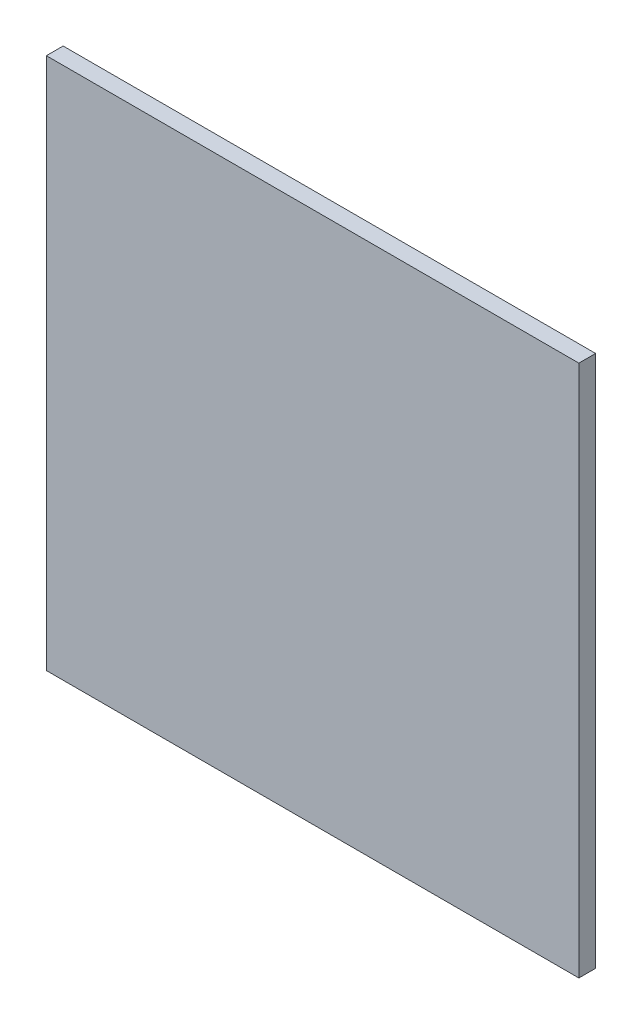
ISO-10303-21;
HEADER;
FILE_DESCRIPTION(('STEP AP214'),'2;1');
FILE_NAME('part.step','',(''),(''),'','','');
FILE_SCHEMA(('AUTOMOTIVE_DESIGN { 1 0 10303 214 1 1 1 1 }'));
ENDSEC;
DATA;
#1=APPLICATION_CONTEXT('core data for automotive mechanical design processes');
#2=APPLICATION_PROTOCOL_DEFINITION('international standard','automotive_design',2000,#1);
#3=PRODUCT_CONTEXT('',#1,'mechanical');
#4=PRODUCT('Part','Part','',(#3));
#5=PRODUCT_RELATED_PRODUCT_CATEGORY('part','',(#4));
#6=PRODUCT_DEFINITION_FORMATION('','',#4);
#7=PRODUCT_DEFINITION_CONTEXT('part definition',#1,'design');
#8=PRODUCT_DEFINITION('design','',#6,#7);
#9=PRODUCT_DEFINITION_SHAPE('','',#8);
#10=(LENGTH_UNIT() NAMED_UNIT(*) SI_UNIT(.MILLI.,.METRE.));
#11=(NAMED_UNIT(*) PLANE_ANGLE_UNIT() SI_UNIT($,.RADIAN.));
#12=(NAMED_UNIT(*) SI_UNIT($,.STERADIAN.) SOLID_ANGLE_UNIT());
#13=UNCERTAINTY_MEASURE_WITH_UNIT(LENGTH_MEASURE(1.E-05),#10,'distance_accuracy_value','');
#14=(GEOMETRIC_REPRESENTATION_CONTEXT(3) GLOBAL_UNCERTAINTY_ASSIGNED_CONTEXT((#13)) GLOBAL_UNIT_ASSIGNED_CONTEXT((#10,
#11,#12)) REPRESENTATION_CONTEXT('',''));
#15=CARTESIAN_POINT('',(0.,0.,0.));
#16=DIRECTION('',(0.,0.,1.));
#17=DIRECTION('',(1.,0.,0.));
#18=AXIS2_PLACEMENT_3D('',#15,#16,#17);
#19=CARTESIAN_POINT('',(0.,0.,0.2));
#20=DIRECTION('',(1.,0.,0.));
#21=DIRECTION('',(0.,0.,-1.));
#22=AXIS2_PLACEMENT_3D('',#19,#20,#21);
#23=PLANE('',#22);
#24=DIRECTION('',(0.,-1.,0.));
#25=VECTOR('',#24,1.);
#26=CARTESIAN_POINT('',(0.,0.,0.));
#27=LINE('',#26,#25);
#28=CARTESIAN_POINT('',(0.,6.35,0.));
#29=VERTEX_POINT('',#28);
#30=CARTESIAN_POINT('',(0.,0.,0.));
#31=VERTEX_POINT('',#30);
#32=EDGE_CURVE('E96',#29,#31,#27,.T.);
#33=ORIENTED_EDGE('',*,*,#32,.T.);
#34=DIRECTION('',(0.,0.,-1.));
#35=VECTOR('',#34,1.);
#36=CARTESIAN_POINT('',(0.,0.,0.2));
#37=LINE('',#36,#35);
#38=CARTESIAN_POINT('',(0.,0.,0.2));
#39=VERTEX_POINT('',#38);
#40=EDGE_CURVE('E11',#39,#31,#37,.T.);
#41=ORIENTED_EDGE('',*,*,#40,.F.);
#42=DIRECTION('',(0.,-1.,0.));
#43=VECTOR('',#42,1.);
#44=CARTESIAN_POINT('',(0.,0.,0.2));
#45=LINE('',#44,#43);
#46=CARTESIAN_POINT('',(0.,6.35,0.2));
#47=VERTEX_POINT('',#46);
#48=EDGE_CURVE('E84',#47,#39,#45,.T.);
#49=ORIENTED_EDGE('',*,*,#48,.F.);
#50=DIRECTION('',(0.,0.,-1.));
#51=VECTOR('',#50,1.);
#52=CARTESIAN_POINT('',(0.,6.35,0.2));
#53=LINE('',#52,#51);
#54=EDGE_CURVE('E92',#47,#29,#53,.T.);
#55=ORIENTED_EDGE('',*,*,#54,.T.);
#56=EDGE_LOOP('',(#33,#41,#49,#55));
#57=FACE_BOUND('',#56,.T.);
#58=ADVANCED_FACE('F33',(#57),#23,.F.);
#59=CARTESIAN_POINT('',(0.,0.,0.2));
#60=DIRECTION('',(0.,1.,0.));
#61=DIRECTION('',(0.,0.,1.));
#62=AXIS2_PLACEMENT_3D('',#59,#60,#61);
#63=PLANE('',#62);
#64=DIRECTION('',(1.,0.,0.));
#65=VECTOR('',#64,1.);
#66=CARTESIAN_POINT('',(0.,0.,0.));
#67=LINE('',#66,#65);
#68=CARTESIAN_POINT('',(6.35,0.,0.));
#69=VERTEX_POINT('',#68);
#70=EDGE_CURVE('E88',#31,#69,#67,.T.);
#71=ORIENTED_EDGE('',*,*,#70,.T.);
#72=DIRECTION('',(0.,0.,-1.));
#73=VECTOR('',#72,1.);
#74=CARTESIAN_POINT('',(6.35,0.,0.2));
#75=LINE('',#74,#73);
#76=CARTESIAN_POINT('',(6.35,0.,0.2));
#77=VERTEX_POINT('',#76);
#78=EDGE_CURVE('E41',#77,#69,#75,.T.);
#79=ORIENTED_EDGE('',*,*,#78,.F.);
#80=DIRECTION('',(1.,0.,0.));
#81=VECTOR('',#80,1.);
#82=CARTESIAN_POINT('',(0.,0.,0.2));
#83=LINE('',#82,#81);
#84=EDGE_CURVE('E79',#39,#77,#83,.T.);
#85=ORIENTED_EDGE('',*,*,#84,.F.);
#86=ORIENTED_EDGE('',*,*,#40,.T.);
#87=EDGE_LOOP('',(#71,#79,#85,#86));
#88=FACE_BOUND('',#87,.T.);
#89=ADVANCED_FACE('F87',(#88),#63,.F.);
#90=CARTESIAN_POINT('',(6.35,0.,0.2));
#91=DIRECTION('',(-1.,0.,0.));
#92=DIRECTION('',(0.,0.,1.));
#93=AXIS2_PLACEMENT_3D('',#90,#91,#92);
#94=PLANE('',#93);
#95=DIRECTION('',(0.,1.,0.));
#96=VECTOR('',#95,1.);
#97=CARTESIAN_POINT('',(6.35,0.,0.));
#98=LINE('',#97,#96);
#99=CARTESIAN_POINT('',(6.35,6.35,0.));
#100=VERTEX_POINT('',#99);
#101=EDGE_CURVE('E66',#69,#100,#98,.T.);
#102=ORIENTED_EDGE('',*,*,#101,.T.);
#103=DIRECTION('',(0.,0.,-1.));
#104=VECTOR('',#103,1.);
#105=CARTESIAN_POINT('',(6.35,6.35,0.2));
#106=LINE('',#105,#104);
#107=CARTESIAN_POINT('',(6.35,6.35,0.2));
#108=VERTEX_POINT('',#107);
#109=EDGE_CURVE('E89',#108,#100,#106,.T.);
#110=ORIENTED_EDGE('',*,*,#109,.F.);
#111=DIRECTION('',(0.,1.,0.));
#112=VECTOR('',#111,1.);
#113=CARTESIAN_POINT('',(6.35,0.,0.2));
#114=LINE('',#113,#112);
#115=EDGE_CURVE('E82',#77,#108,#114,.T.);
#116=ORIENTED_EDGE('',*,*,#115,.F.);
#117=ORIENTED_EDGE('',*,*,#78,.T.);
#118=EDGE_LOOP('',(#102,#110,#116,#117));
#119=FACE_BOUND('',#118,.T.);
#120=ADVANCED_FACE('F90',(#119),#94,.F.);
#121=CARTESIAN_POINT('',(0.,6.35,0.2));
#122=DIRECTION('',(0.,-1.,0.));
#123=DIRECTION('',(0.,0.,-1.));
#124=AXIS2_PLACEMENT_3D('',#121,#122,#123);
#125=PLANE('',#124);
#126=DIRECTION('',(-1.,0.,0.));
#127=VECTOR('',#126,1.);
#128=CARTESIAN_POINT('',(0.,6.35,0.));
#129=LINE('',#128,#127);
#130=EDGE_CURVE('E72',#100,#29,#129,.T.);
#131=ORIENTED_EDGE('',*,*,#130,.T.);
#132=ORIENTED_EDGE('',*,*,#54,.F.);
#133=DIRECTION('',(-1.,0.,0.));
#134=VECTOR('',#133,1.);
#135=CARTESIAN_POINT('',(0.,6.35,0.2));
#136=LINE('',#135,#134);
#137=EDGE_CURVE('E49',#108,#47,#136,.T.);
#138=ORIENTED_EDGE('',*,*,#137,.F.);
#139=ORIENTED_EDGE('',*,*,#109,.T.);
#140=EDGE_LOOP('',(#131,#132,#138,#139));
#141=FACE_BOUND('',#140,.T.);
#142=ADVANCED_FACE('F103',(#141),#125,.F.);
#143=CARTESIAN_POINT('',(0.,0.,0.2));
#144=DIRECTION('',(0.,0.,-1.));
#145=DIRECTION('',(-1.,0.,0.));
#146=AXIS2_PLACEMENT_3D('',#143,#144,#145);
#147=PLANE('',#146);
#148=ORIENTED_EDGE('',*,*,#48,.T.);
#149=ORIENTED_EDGE('',*,*,#84,.T.);
#150=ORIENTED_EDGE('',*,*,#115,.T.);
#151=ORIENTED_EDGE('',*,*,#137,.T.);
#152=EDGE_LOOP('',(#148,#149,#150,#151));
#153=FACE_BOUND('',#152,.T.);
#154=ADVANCED_FACE('F80',(#153),#147,.F.);
#155=CARTESIAN_POINT('',(0.,0.,0.));
#156=DIRECTION('',(0.,0.,-1.));
#157=DIRECTION('',(-1.,0.,0.));
#158=AXIS2_PLACEMENT_3D('',#155,#156,#157);
#159=PLANE('',#158);
#160=ORIENTED_EDGE('',*,*,#32,.F.);
#161=ORIENTED_EDGE('',*,*,#130,.F.);
#162=ORIENTED_EDGE('',*,*,#101,.F.);
#163=ORIENTED_EDGE('',*,*,#70,.F.);
#164=EDGE_LOOP('',(#160,#161,#162,#163));
#165=FACE_BOUND('',#164,.T.);
#166=ADVANCED_FACE('F106',(#165),#159,.T.);
#167=CLOSED_SHELL('',(#58,#89,#120,#142,#154,#166));
#168=MANIFOLD_SOLID_BREP('B2',#167);
#169=ADVANCED_BREP_SHAPE_REPRESENTATION('',(#18,#168),#14);
#170=SHAPE_DEFINITION_REPRESENTATION(#9,#169);
ENDSEC;
END-ISO-10303-21;
